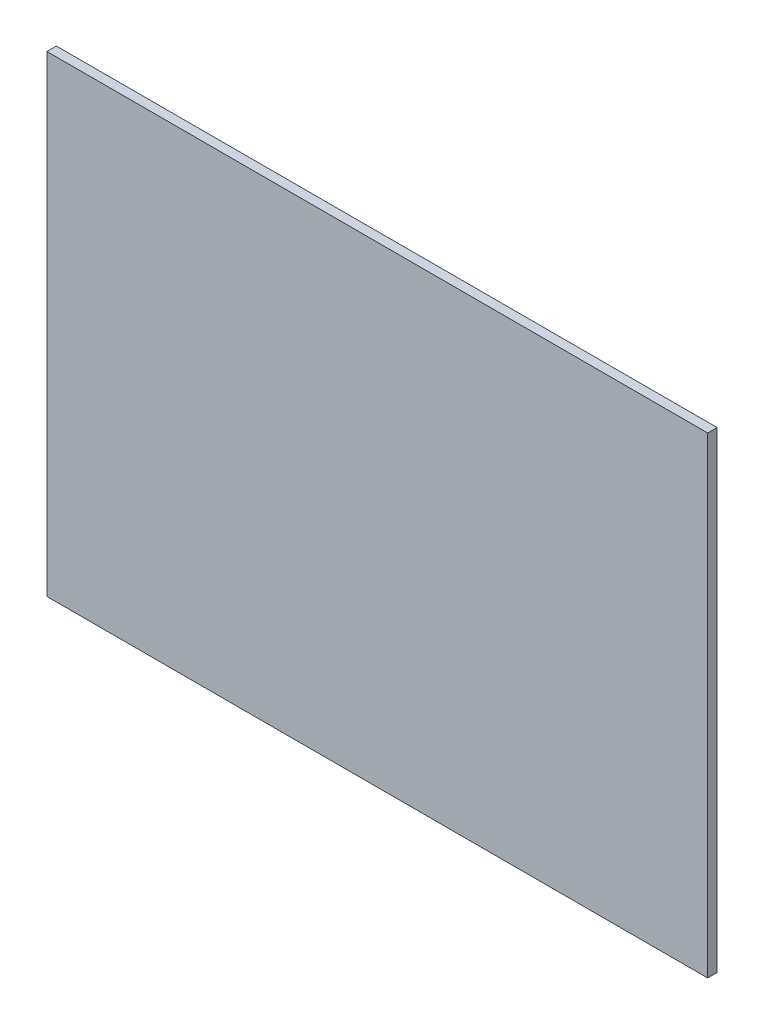
ISO-10303-21;
HEADER;
FILE_DESCRIPTION(('STEP AP214'),'2;1');
FILE_NAME('part.step','',(''),(''),'','','');
FILE_SCHEMA(('AUTOMOTIVE_DESIGN { 1 0 10303 214 1 1 1 1 }'));
ENDSEC;
DATA;
#1=APPLICATION_CONTEXT('core data for automotive mechanical design processes');
#2=APPLICATION_PROTOCOL_DEFINITION('international standard','automotive_design',2000,#1);
#3=PRODUCT_CONTEXT('',#1,'mechanical');
#4=PRODUCT('Part','Part','',(#3));
#5=PRODUCT_RELATED_PRODUCT_CATEGORY('part','',(#4));
#6=PRODUCT_DEFINITION_FORMATION('','',#4);
#7=PRODUCT_DEFINITION_CONTEXT('part definition',#1,'design');
#8=PRODUCT_DEFINITION('design','',#6,#7);
#9=PRODUCT_DEFINITION_SHAPE('','',#8);
#10=(LENGTH_UNIT() NAMED_UNIT(*) SI_UNIT(.MILLI.,.METRE.));
#11=(NAMED_UNIT(*) PLANE_ANGLE_UNIT() SI_UNIT($,.RADIAN.));
#12=(NAMED_UNIT(*) SI_UNIT($,.STERADIAN.) SOLID_ANGLE_UNIT());
#13=UNCERTAINTY_MEASURE_WITH_UNIT(LENGTH_MEASURE(1.E-05),#10,'distance_accuracy_value','');
#14=(GEOMETRIC_REPRESENTATION_CONTEXT(3) GLOBAL_UNCERTAINTY_ASSIGNED_CONTEXT((#13)) GLOBAL_UNIT_ASSIGNED_CONTEXT((#10,
#11,#12)) REPRESENTATION_CONTEXT('',''));
#15=CARTESIAN_POINT('',(0.,0.,0.));
#16=DIRECTION('',(0.,0.,1.));
#17=DIRECTION('',(1.,0.,0.));
#18=AXIS2_PLACEMENT_3D('',#15,#16,#17);
#19=CARTESIAN_POINT('',(161.698645521619,-166.038012074488,-3.));
#20=DIRECTION('',(0.,1.,0.));
#21=DIRECTION('',(-1.,0.,0.));
#22=AXIS2_PLACEMENT_3D('',#19,#20,#21);
#23=PLANE('',#22);
#24=DIRECTION('',(-1.,0.,0.));
#25=VECTOR('',#24,1.);
#26=CARTESIAN_POINT('',(161.698645521619,-166.038012074488,0.));
#27=LINE('',#26,#25);
#28=CARTESIAN_POINT('',(161.698645521619,-166.038012074488,0.));
#29=VERTEX_POINT('',#28);
#30=CARTESIAN_POINT('',(-48.3013544783814,-166.038012074488,0.));
#31=VERTEX_POINT('',#30);
#32=EDGE_CURVE('E96',#29,#31,#27,.T.);
#33=ORIENTED_EDGE('',*,*,#32,.T.);
#34=DIRECTION('',(0.,0.,1.));
#35=VECTOR('',#34,1.);
#36=CARTESIAN_POINT('',(-48.3013544783814,-166.038012074488,-3.));
#37=LINE('',#36,#35);
#38=CARTESIAN_POINT('',(-48.3013544783814,-166.038012074488,-3.));
#39=VERTEX_POINT('',#38);
#40=EDGE_CURVE('E11',#39,#31,#37,.T.);
#41=ORIENTED_EDGE('',*,*,#40,.F.);
#42=DIRECTION('',(-1.,0.,0.));
#43=VECTOR('',#42,1.);
#44=CARTESIAN_POINT('',(161.698645521619,-166.038012074488,-3.));
#45=LINE('',#44,#43);
#46=CARTESIAN_POINT('',(161.698645521619,-166.038012074488,-3.));
#47=VERTEX_POINT('',#46);
#48=EDGE_CURVE('E84',#47,#39,#45,.T.);
#49=ORIENTED_EDGE('',*,*,#48,.F.);
#50=DIRECTION('',(0.,0.,1.));
#51=VECTOR('',#50,1.);
#52=CARTESIAN_POINT('',(161.698645521619,-166.038012074488,-3.));
#53=LINE('',#52,#51);
#54=EDGE_CURVE('E92',#47,#29,#53,.T.);
#55=ORIENTED_EDGE('',*,*,#54,.T.);
#56=EDGE_LOOP('',(#33,#41,#49,#55));
#57=FACE_BOUND('',#56,.T.);
#58=ADVANCED_FACE('F33',(#57),#23,.F.);
#59=CARTESIAN_POINT('',(-48.3013544783814,-166.038012074488,-3.));
#60=DIRECTION('',(1.,0.,0.));
#61=DIRECTION('',(0.,0.,-1.));
#62=AXIS2_PLACEMENT_3D('',#59,#60,#61);
#63=PLANE('',#62);
#64=DIRECTION('',(0.,1.,0.));
#65=VECTOR('',#64,1.);
#66=CARTESIAN_POINT('',(-48.3013544783814,-166.038012074488,0.));
#67=LINE('',#66,#65);
#68=CARTESIAN_POINT('',(-48.3013544783814,-16.0380120744881,0.));
#69=VERTEX_POINT('',#68);
#70=EDGE_CURVE('E88',#31,#69,#67,.T.);
#71=ORIENTED_EDGE('',*,*,#70,.T.);
#72=DIRECTION('',(0.,0.,1.));
#73=VECTOR('',#72,1.);
#74=CARTESIAN_POINT('',(-48.3013544783814,-16.0380120744881,-3.));
#75=LINE('',#74,#73);
#76=CARTESIAN_POINT('',(-48.3013544783814,-16.0380120744881,-3.));
#77=VERTEX_POINT('',#76);
#78=EDGE_CURVE('E41',#77,#69,#75,.T.);
#79=ORIENTED_EDGE('',*,*,#78,.F.);
#80=DIRECTION('',(0.,1.,0.));
#81=VECTOR('',#80,1.);
#82=CARTESIAN_POINT('',(-48.3013544783814,-166.038012074488,-3.));
#83=LINE('',#82,#81);
#84=EDGE_CURVE('E79',#39,#77,#83,.T.);
#85=ORIENTED_EDGE('',*,*,#84,.F.);
#86=ORIENTED_EDGE('',*,*,#40,.T.);
#87=EDGE_LOOP('',(#71,#79,#85,#86));
#88=FACE_BOUND('',#87,.T.);
#89=ADVANCED_FACE('F87',(#88),#63,.F.);
#90=CARTESIAN_POINT('',(-48.3013544783814,-16.0380120744881,-3.));
#91=DIRECTION('',(0.,-1.,0.));
#92=DIRECTION('',(0.,0.,-1.));
#93=AXIS2_PLACEMENT_3D('',#90,#91,#92);
#94=PLANE('',#93);
#95=DIRECTION('',(1.,0.,0.));
#96=VECTOR('',#95,1.);
#97=CARTESIAN_POINT('',(-48.3013544783814,-16.0380120744881,0.));
#98=LINE('',#97,#96);
#99=CARTESIAN_POINT('',(161.698645521619,-16.0380120744881,0.));
#100=VERTEX_POINT('',#99);
#101=EDGE_CURVE('E66',#69,#100,#98,.T.);
#102=ORIENTED_EDGE('',*,*,#101,.T.);
#103=DIRECTION('',(0.,0.,1.));
#104=VECTOR('',#103,1.);
#105=CARTESIAN_POINT('',(161.698645521619,-16.0380120744881,-3.));
#106=LINE('',#105,#104);
#107=CARTESIAN_POINT('',(161.698645521619,-16.0380120744881,-3.));
#108=VERTEX_POINT('',#107);
#109=EDGE_CURVE('E89',#108,#100,#106,.T.);
#110=ORIENTED_EDGE('',*,*,#109,.F.);
#111=DIRECTION('',(1.,0.,0.));
#112=VECTOR('',#111,1.);
#113=CARTESIAN_POINT('',(-48.3013544783814,-16.0380120744881,-3.));
#114=LINE('',#113,#112);
#115=EDGE_CURVE('E82',#77,#108,#114,.T.);
#116=ORIENTED_EDGE('',*,*,#115,.F.);
#117=ORIENTED_EDGE('',*,*,#78,.T.);
#118=EDGE_LOOP('',(#102,#110,#116,#117));
#119=FACE_BOUND('',#118,.T.);
#120=ADVANCED_FACE('F90',(#119),#94,.F.);
#121=CARTESIAN_POINT('',(161.698645521619,-16.0380120744881,-3.));
#122=DIRECTION('',(-1.,0.,0.));
#123=DIRECTION('',(0.,0.,1.));
#124=AXIS2_PLACEMENT_3D('',#121,#122,#123);
#125=PLANE('',#124);
#126=DIRECTION('',(0.,-1.,0.));
#127=VECTOR('',#126,1.);
#128=CARTESIAN_POINT('',(161.698645521619,-16.0380120744881,0.));
#129=LINE('',#128,#127);
#130=EDGE_CURVE('E72',#100,#29,#129,.T.);
#131=ORIENTED_EDGE('',*,*,#130,.T.);
#132=ORIENTED_EDGE('',*,*,#54,.F.);
#133=DIRECTION('',(0.,-1.,0.));
#134=VECTOR('',#133,1.);
#135=CARTESIAN_POINT('',(161.698645521619,-16.0380120744881,-3.));
#136=LINE('',#135,#134);
#137=EDGE_CURVE('E49',#108,#47,#136,.T.);
#138=ORIENTED_EDGE('',*,*,#137,.F.);
#139=ORIENTED_EDGE('',*,*,#109,.T.);
#140=EDGE_LOOP('',(#131,#132,#138,#139));
#141=FACE_BOUND('',#140,.T.);
#142=ADVANCED_FACE('F103',(#141),#125,.F.);
#143=CARTESIAN_POINT('',(0.,0.,-3.));
#144=DIRECTION('',(0.,0.,-1.));
#145=DIRECTION('',(-1.,0.,0.));
#146=AXIS2_PLACEMENT_3D('',#143,#144,#145);
#147=PLANE('',#146);
#148=ORIENTED_EDGE('',*,*,#48,.T.);
#149=ORIENTED_EDGE('',*,*,#84,.T.);
#150=ORIENTED_EDGE('',*,*,#115,.T.);
#151=ORIENTED_EDGE('',*,*,#137,.T.);
#152=EDGE_LOOP('',(#148,#149,#150,#151));
#153=FACE_BOUND('',#152,.T.);
#154=ADVANCED_FACE('F80',(#153),#147,.T.);
#155=CARTESIAN_POINT('',(0.,0.,0.));
#156=DIRECTION('',(0.,0.,-1.));
#157=DIRECTION('',(-1.,0.,0.));
#158=AXIS2_PLACEMENT_3D('',#155,#156,#157);
#159=PLANE('',#158);
#160=ORIENTED_EDGE('',*,*,#32,.F.);
#161=ORIENTED_EDGE('',*,*,#130,.F.);
#162=ORIENTED_EDGE('',*,*,#101,.F.);
#163=ORIENTED_EDGE('',*,*,#70,.F.);
#164=EDGE_LOOP('',(#160,#161,#162,#163));
#165=FACE_BOUND('',#164,.T.);
#166=ADVANCED_FACE('F106',(#165),#159,.F.);
#167=CLOSED_SHELL('',(#58,#89,#120,#142,#154,#166));
#168=MANIFOLD_SOLID_BREP('B2',#167);
#169=ADVANCED_BREP_SHAPE_REPRESENTATION('',(#18,#168),#14);
#170=SHAPE_DEFINITION_REPRESENTATION(#9,#169);
ENDSEC;
END-ISO-10303-21;
